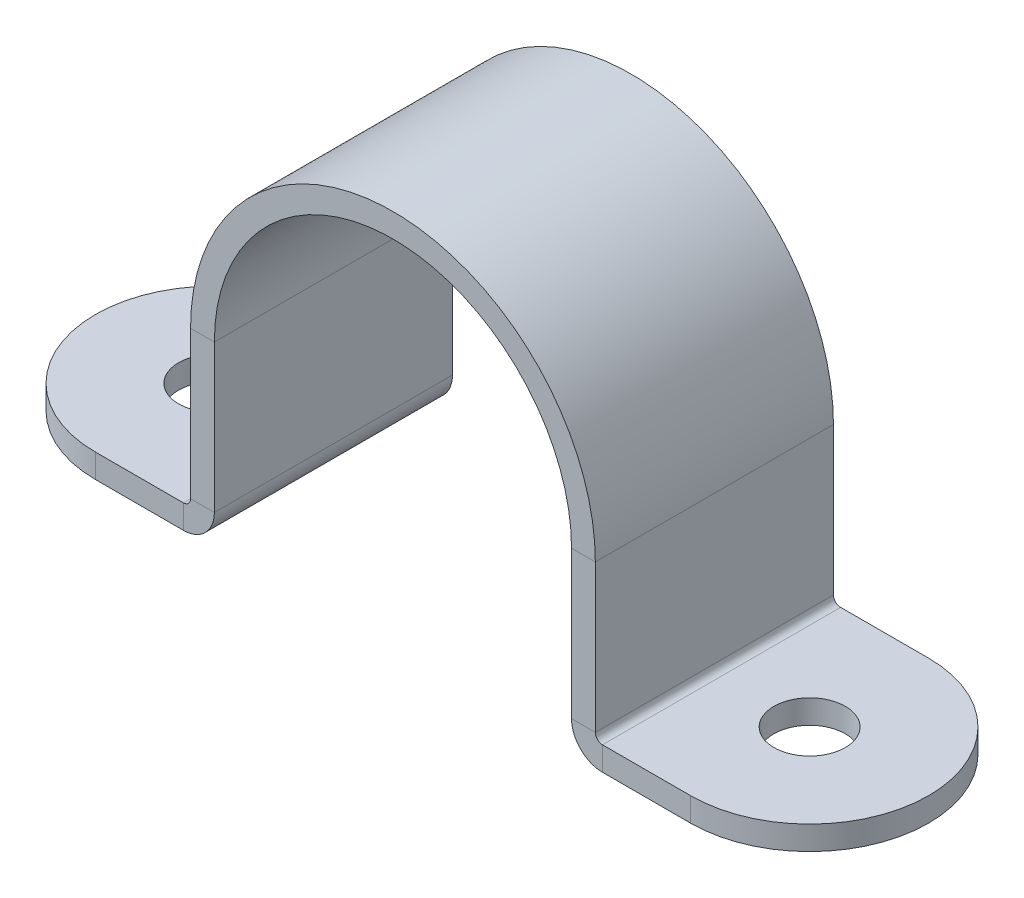
ISO-10303-21;
HEADER;
FILE_DESCRIPTION(('STEP AP214'),'2;1');
FILE_NAME('part.step','',(''),(''),'','','');
FILE_SCHEMA(('AUTOMOTIVE_DESIGN { 1 0 10303 214 1 1 1 1 }'));
ENDSEC;
DATA;
#1=APPLICATION_CONTEXT('core data for automotive mechanical design processes');
#2=APPLICATION_PROTOCOL_DEFINITION('international standard','automotive_design',2000,#1);
#3=PRODUCT_CONTEXT('',#1,'mechanical');
#4=PRODUCT('Part','Part','',(#3));
#5=PRODUCT_RELATED_PRODUCT_CATEGORY('part','',(#4));
#6=PRODUCT_DEFINITION_FORMATION('','',#4);
#7=PRODUCT_DEFINITION_CONTEXT('part definition',#1,'design');
#8=PRODUCT_DEFINITION('design','',#6,#7);
#9=PRODUCT_DEFINITION_SHAPE('','',#8);
#10=(LENGTH_UNIT() NAMED_UNIT(*) SI_UNIT(.MILLI.,.METRE.));
#11=(NAMED_UNIT(*) PLANE_ANGLE_UNIT() SI_UNIT($,.RADIAN.));
#12=(NAMED_UNIT(*) SI_UNIT($,.STERADIAN.) SOLID_ANGLE_UNIT());
#13=UNCERTAINTY_MEASURE_WITH_UNIT(LENGTH_MEASURE(1.E-05),#10,'distance_accuracy_value','');
#14=(GEOMETRIC_REPRESENTATION_CONTEXT(3) GLOBAL_UNCERTAINTY_ASSIGNED_CONTEXT((#13)) GLOBAL_UNIT_ASSIGNED_CONTEXT((#10,
#11,#12)) REPRESENTATION_CONTEXT('',''));
#15=CARTESIAN_POINT('',(0.,0.,0.));
#16=DIRECTION('',(0.,0.,1.));
#17=DIRECTION('',(1.,0.,0.));
#18=AXIS2_PLACEMENT_3D('',#15,#16,#17);
#19=CARTESIAN_POINT('',(32.8246153846154,40.64,12.7));
#20=DIRECTION('',(0.,-1.,0.));
#21=DIRECTION('',(0.,0.,-1.));
#22=AXIS2_PLACEMENT_3D('',#19,#20,#21);
#23=CYLINDRICAL_SURFACE('',#22,3.81);
#24=CARTESIAN_POINT('',(32.8246153846154,0.,12.7));
#25=DIRECTION('',(0.,-1.,0.));
#26=DIRECTION('',(0.,0.,-1.));
#27=AXIS2_PLACEMENT_3D('',#24,#25,#26);
#28=CIRCLE('',#27,3.81);
#29=CARTESIAN_POINT('',(32.8246153846154,0.,8.89000000000004));
#30=VERTEX_POINT('',#29);
#31=EDGE_CURVE('E232',#30,#30,#28,.T.);
#32=ORIENTED_EDGE('',*,*,#31,.T.);
#33=EDGE_LOOP('',(#32));
#34=FACE_BOUND('',#33,.T.);
#35=CARTESIAN_POINT('',(32.8246153846154,2.53999999999999,12.7));
#36=DIRECTION('',(0.,-1.,0.));
#37=DIRECTION('',(0.,0.,-1.));
#38=AXIS2_PLACEMENT_3D('',#35,#36,#37);
#39=CIRCLE('',#38,3.81);
#40=CARTESIAN_POINT('',(32.8246153846154,2.53999999999999,8.89000000000004));
#41=VERTEX_POINT('',#40);
#42=EDGE_CURVE('E212',#41,#41,#39,.T.);
#43=ORIENTED_EDGE('',*,*,#42,.F.);
#44=EDGE_LOOP('',(#43));
#45=FACE_BOUND('',#44,.T.);
#46=ADVANCED_FACE('F43',(#34,#45),#23,.F.);
#47=CARTESIAN_POINT('',(32.8246153846154,69.8744370734619,12.7));
#48=DIRECTION('',(0.,-1.,0.));
#49=DIRECTION('',(0.,0.,-1.));
#50=AXIS2_PLACEMENT_3D('',#47,#48,#49);
#51=CYLINDRICAL_SURFACE('',#50,12.7);
#52=DIRECTION('',(0.,-1.,0.));
#53=VECTOR('',#52,1.);
#54=CARTESIAN_POINT('',(32.8246153846154,69.8744370734619,25.4));
#55=LINE('',#54,#53);
#56=CARTESIAN_POINT('',(32.8246153846154,2.54,25.4));
#57=VERTEX_POINT('',#56);
#58=CARTESIAN_POINT('',(32.8246153846154,0.,25.4));
#59=VERTEX_POINT('',#58);
#60=EDGE_CURVE('E230',#57,#59,#55,.T.);
#61=ORIENTED_EDGE('',*,*,#60,.T.);
#62=CARTESIAN_POINT('',(32.8246153846154,0.,12.7));
#63=DIRECTION('',(0.,1.,0.));
#64=DIRECTION('',(-1.,0.,0.));
#65=AXIS2_PLACEMENT_3D('',#62,#63,#64);
#66=CIRCLE('',#65,12.7);
#67=CARTESIAN_POINT('',(32.8246153846154,0.,0.));
#68=VERTEX_POINT('',#67);
#69=EDGE_CURVE('E75',#68,#59,#66,.F.);
#70=ORIENTED_EDGE('',*,*,#69,.F.);
#71=DIRECTION('',(0.,-1.,0.));
#72=VECTOR('',#71,1.);
#73=CARTESIAN_POINT('',(32.8246153846154,69.8744370734619,0.));
#74=LINE('',#73,#72);
#75=CARTESIAN_POINT('',(32.8246153846154,2.53999999999997,0.));
#76=VERTEX_POINT('',#75);
#77=EDGE_CURVE('E216',#76,#68,#74,.T.);
#78=ORIENTED_EDGE('',*,*,#77,.F.);
#79=CARTESIAN_POINT('',(32.8246153846154,2.53999999999999,12.7));
#80=DIRECTION('',(0.,-1.,0.));
#81=DIRECTION('',(0.,0.,-1.));
#82=AXIS2_PLACEMENT_3D('',#79,#80,#81);
#83=CIRCLE('',#82,12.7);
#84=EDGE_CURVE('E11',#57,#76,#83,.F.);
#85=ORIENTED_EDGE('',*,*,#84,.F.);
#86=EDGE_LOOP('',(#61,#70,#78,#85));
#87=FACE_BOUND('',#86,.T.);
#88=ADVANCED_FACE('F411',(#87),#51,.T.);
#89=CARTESIAN_POINT('',(22.6646153846154,69.8744370734619,25.4));
#90=DIRECTION('',(0.,0.,1.));
#91=DIRECTION('',(1.,0.,0.));
#92=AXIS2_PLACEMENT_3D('',#89,#90,#91);
#93=PLANE('',#92);
#94=DIRECTION('',(1.,0.,0.));
#95=VECTOR('',#94,1.);
#96=CARTESIAN_POINT('',(20.1246153846154,0.,25.4));
#97=LINE('',#96,#95);
#98=CARTESIAN_POINT('',(23.4266153846154,0.,25.4));
#99=VERTEX_POINT('',#98);
#100=EDGE_CURVE('E228',#99,#59,#97,.T.);
#101=ORIENTED_EDGE('',*,*,#100,.T.);
#102=ORIENTED_EDGE('',*,*,#60,.F.);
#103=DIRECTION('',(-1.,0.,0.));
#104=VECTOR('',#103,1.);
#105=CARTESIAN_POINT('',(22.6646153846154,2.54,25.4));
#106=LINE('',#105,#104);
#107=CARTESIAN_POINT('',(23.4266153846154,2.54000000000001,25.4));
#108=VERTEX_POINT('',#107);
#109=EDGE_CURVE('E225',#57,#108,#106,.T.);
#110=ORIENTED_EDGE('',*,*,#109,.T.);
#111=DIRECTION('',(0.,-1.,0.));
#112=VECTOR('',#111,1.);
#113=CARTESIAN_POINT('',(23.4266153846154,69.8744370734619,25.4));
#114=LINE('',#113,#112);
#115=EDGE_CURVE('E222',#108,#99,#114,.T.);
#116=ORIENTED_EDGE('',*,*,#115,.T.);
#117=EDGE_LOOP('',(#101,#102,#110,#116));
#118=FACE_BOUND('',#117,.T.);
#119=ADVANCED_FACE('F408',(#118),#93,.T.);
#120=CARTESIAN_POINT('',(20.1246153846154,0.,25.4));
#121=DIRECTION('',(0.,1.,0.));
#122=DIRECTION('',(-1.,0.,0.));
#123=AXIS2_PLACEMENT_3D('',#120,#121,#122);
#124=PLANE('',#123);
#125=ORIENTED_EDGE('',*,*,#31,.F.);
#126=EDGE_LOOP('',(#125));
#127=FACE_BOUND('',#126,.T.);
#128=ORIENTED_EDGE('',*,*,#100,.F.);
#129=DIRECTION('',(0.,0.,-1.));
#130=VECTOR('',#129,1.);
#131=CARTESIAN_POINT('',(23.4266153846154,0.,25.4));
#132=LINE('',#131,#130);
#133=CARTESIAN_POINT('',(23.4266153846154,0.,0.));
#134=VERTEX_POINT('',#133);
#135=EDGE_CURVE('E220',#99,#134,#132,.T.);
#136=ORIENTED_EDGE('',*,*,#135,.T.);
#137=DIRECTION('',(-1.,0.,0.));
#138=VECTOR('',#137,1.);
#139=CARTESIAN_POINT('',(22.6646153846154,0.,0.));
#140=LINE('',#139,#138);
#141=EDGE_CURVE('E80',#68,#134,#140,.T.);
#142=ORIENTED_EDGE('',*,*,#141,.F.);
#143=ORIENTED_EDGE('',*,*,#69,.T.);
#144=EDGE_LOOP('',(#128,#136,#142,#143));
#145=FACE_BOUND('',#144,.T.);
#146=ADVANCED_FACE('F405',(#127,#145),#124,.F.);
#147=CARTESIAN_POINT('',(22.6646153846154,69.8744370734619,0.));
#148=DIRECTION('',(0.,0.,1.));
#149=DIRECTION('',(1.,0.,0.));
#150=AXIS2_PLACEMENT_3D('',#147,#148,#149);
#151=PLANE('',#150);
#152=ORIENTED_EDGE('',*,*,#77,.T.);
#153=ORIENTED_EDGE('',*,*,#141,.T.);
#154=DIRECTION('',(0.,-1.,0.));
#155=VECTOR('',#154,1.);
#156=CARTESIAN_POINT('',(23.4266153846154,69.8744370734619,0.));
#157=LINE('',#156,#155);
#158=CARTESIAN_POINT('',(23.4266153846154,2.53999999999999,0.));
#159=VERTEX_POINT('',#158);
#160=EDGE_CURVE('E47',#159,#134,#157,.T.);
#161=ORIENTED_EDGE('',*,*,#160,.F.);
#162=DIRECTION('',(-1.,0.,0.));
#163=VECTOR('',#162,1.);
#164=CARTESIAN_POINT('',(22.6646153846154,2.53999999999998,0.));
#165=LINE('',#164,#163);
#166=EDGE_CURVE('E210',#76,#159,#165,.T.);
#167=ORIENTED_EDGE('',*,*,#166,.F.);
#168=EDGE_LOOP('',(#152,#153,#161,#167));
#169=FACE_BOUND('',#168,.T.);
#170=ADVANCED_FACE('F413',(#169),#151,.F.);
#171=CARTESIAN_POINT('',(22.6646153846154,2.54,25.4));
#172=DIRECTION('',(0.,-1.,0.));
#173=DIRECTION('',(0.,0.,-1.));
#174=AXIS2_PLACEMENT_3D('',#171,#172,#173);
#175=PLANE('',#174);
#176=ORIENTED_EDGE('',*,*,#42,.T.);
#177=EDGE_LOOP('',(#176));
#178=FACE_BOUND('',#177,.T.);
#179=ORIENTED_EDGE('',*,*,#166,.T.);
#180=DIRECTION('',(0.,0.,1.));
#181=VECTOR('',#180,1.);
#182=CARTESIAN_POINT('',(23.4266153846154,2.54,25.4));
#183=LINE('',#182,#181);
#184=EDGE_CURVE('E53',#159,#108,#183,.T.);
#185=ORIENTED_EDGE('',*,*,#184,.T.);
#186=ORIENTED_EDGE('',*,*,#109,.F.);
#187=ORIENTED_EDGE('',*,*,#84,.T.);
#188=EDGE_LOOP('',(#179,#185,#186,#187));
#189=FACE_BOUND('',#188,.T.);
#190=ADVANCED_FACE('F45',(#178,#189),#175,.F.);
#191=CARTESIAN_POINT('',(-37.1069331648408,38.1,0.));
#192=DIRECTION('',(0.,0.,1.));
#193=DIRECTION('',(0.,-1.,0.));
#194=AXIS2_PLACEMENT_3D('',#191,#192,#193);
#195=PLANE('',#194);
#196=DIRECTION('',(1.,0.,0.));
#197=VECTOR('',#196,1.);
#198=CARTESIAN_POINT('',(-37.1069331648408,19.05,0.));
#199=LINE('',#198,#197);
#200=CARTESIAN_POINT('',(20.1246153846154,19.05,0.));
#201=VERTEX_POINT('',#200);
#202=CARTESIAN_POINT('',(22.6646153846154,19.05,0.));
#203=VERTEX_POINT('',#202);
#204=EDGE_CURVE('E199',#201,#203,#199,.T.);
#205=ORIENTED_EDGE('',*,*,#204,.T.);
#206=DIRECTION('',(0.,-1.,0.));
#207=VECTOR('',#206,1.);
#208=CARTESIAN_POINT('',(22.6646153846154,38.1,0.));
#209=LINE('',#208,#207);
#210=CARTESIAN_POINT('',(22.6646153846154,3.302,0.));
#211=VERTEX_POINT('',#210);
#212=EDGE_CURVE('E197',#203,#211,#209,.T.);
#213=ORIENTED_EDGE('',*,*,#212,.T.);
#214=DIRECTION('',(1.,0.,0.));
#215=VECTOR('',#214,1.);
#216=CARTESIAN_POINT('',(-37.1069331648408,3.30200000000003,0.));
#217=LINE('',#216,#215);
#218=CARTESIAN_POINT('',(20.1246153846154,3.30200000000005,0.));
#219=VERTEX_POINT('',#218);
#220=EDGE_CURVE('E182',#219,#211,#217,.T.);
#221=ORIENTED_EDGE('',*,*,#220,.F.);
#222=DIRECTION('',(0.,-1.,0.));
#223=VECTOR('',#222,1.);
#224=CARTESIAN_POINT('',(20.1246153846154,38.1,0.));
#225=LINE('',#224,#223);
#226=EDGE_CURVE('E177',#201,#219,#225,.T.);
#227=ORIENTED_EDGE('',*,*,#226,.F.);
#228=EDGE_LOOP('',(#205,#213,#221,#227));
#229=FACE_BOUND('',#228,.T.);
#230=ADVANCED_FACE('F195',(#229),#195,.F.);
#231=CARTESIAN_POINT('',(22.6646153846154,40.64,25.4));
#232=DIRECTION('',(-1.,0.,0.));
#233=DIRECTION('',(0.,-1.,0.));
#234=AXIS2_PLACEMENT_3D('',#231,#232,#233);
#235=PLANE('',#234);
#236=DIRECTION('',(0.,1.,0.));
#237=VECTOR('',#236,1.);
#238=CARTESIAN_POINT('',(22.6646153846154,40.64,25.4));
#239=LINE('',#238,#237);
#240=CARTESIAN_POINT('',(22.6646153846154,3.30200000000007,25.4));
#241=VERTEX_POINT('',#240);
#242=CARTESIAN_POINT('',(22.6646153846154,19.05,25.4));
#243=VERTEX_POINT('',#242);
#244=EDGE_CURVE('E244',#241,#243,#239,.T.);
#245=ORIENTED_EDGE('',*,*,#244,.F.);
#246=DIRECTION('',(0.,0.,-1.));
#247=VECTOR('',#246,1.);
#248=CARTESIAN_POINT('',(22.6646153846154,3.30200000000001,25.4));
#249=LINE('',#248,#247);
#250=EDGE_CURVE('E250',#241,#211,#249,.T.);
#251=ORIENTED_EDGE('',*,*,#250,.T.);
#252=ORIENTED_EDGE('',*,*,#212,.F.);
#253=DIRECTION('',(0.,0.,-1.));
#254=VECTOR('',#253,1.);
#255=CARTESIAN_POINT('',(22.6646153846154,19.05,25.4));
#256=LINE('',#255,#254);
#257=EDGE_CURVE('E247',#203,#243,#256,.F.);
#258=ORIENTED_EDGE('',*,*,#257,.T.);
#259=EDGE_LOOP('',(#245,#251,#252,#258));
#260=FACE_BOUND('',#259,.T.);
#261=ADVANCED_FACE('F253',(#260),#235,.F.);
#262=CARTESIAN_POINT('',(-37.1069331648408,38.1,25.4));
#263=DIRECTION('',(0.,0.,1.));
#264=DIRECTION('',(0.,-1.,0.));
#265=AXIS2_PLACEMENT_3D('',#262,#263,#264);
#266=PLANE('',#265);
#267=ORIENTED_EDGE('',*,*,#244,.T.);
#268=DIRECTION('',(1.,0.,0.));
#269=VECTOR('',#268,1.);
#270=CARTESIAN_POINT('',(-37.1069331648408,19.05,25.4));
#271=LINE('',#270,#269);
#272=CARTESIAN_POINT('',(20.1246153846154,19.05,25.4));
#273=VERTEX_POINT('',#272);
#274=EDGE_CURVE('E200',#273,#243,#271,.T.);
#275=ORIENTED_EDGE('',*,*,#274,.F.);
#276=DIRECTION('',(0.,-1.,0.));
#277=VECTOR('',#276,1.);
#278=CARTESIAN_POINT('',(20.1246153846154,38.1,25.4));
#279=LINE('',#278,#277);
#280=CARTESIAN_POINT('',(20.1246153846154,3.3020000000001,25.4));
#281=VERTEX_POINT('',#280);
#282=EDGE_CURVE('E242',#273,#281,#279,.T.);
#283=ORIENTED_EDGE('',*,*,#282,.T.);
#284=DIRECTION('',(1.,0.,0.));
#285=VECTOR('',#284,1.);
#286=CARTESIAN_POINT('',(-37.1069331648408,3.30200000000005,25.4));
#287=LINE('',#286,#285);
#288=EDGE_CURVE('E192',#281,#241,#287,.T.);
#289=ORIENTED_EDGE('',*,*,#288,.T.);
#290=EDGE_LOOP('',(#267,#275,#283,#289));
#291=FACE_BOUND('',#290,.T.);
#292=ADVANCED_FACE('F403',(#291),#266,.T.);
#293=CARTESIAN_POINT('',(20.1246153846154,38.1,25.4));
#294=DIRECTION('',(1.,0.,0.));
#295=DIRECTION('',(0.,1.,0.));
#296=AXIS2_PLACEMENT_3D('',#293,#294,#295);
#297=PLANE('',#296);
#298=ORIENTED_EDGE('',*,*,#226,.T.);
#299=DIRECTION('',(0.,0.,1.));
#300=VECTOR('',#299,1.);
#301=CARTESIAN_POINT('',(20.1246153846154,3.30200000000001,25.4));
#302=LINE('',#301,#300);
#303=EDGE_CURVE('E165',#219,#281,#302,.T.);
#304=ORIENTED_EDGE('',*,*,#303,.T.);
#305=ORIENTED_EDGE('',*,*,#282,.F.);
#306=DIRECTION('',(0.,0.,1.));
#307=VECTOR('',#306,1.);
#308=CARTESIAN_POINT('',(20.1246153846154,19.05,0.));
#309=LINE('',#308,#307);
#310=EDGE_CURVE('E176',#273,#201,#309,.F.);
#311=ORIENTED_EDGE('',*,*,#310,.T.);
#312=EDGE_LOOP('',(#298,#304,#305,#311));
#313=FACE_BOUND('',#312,.T.);
#314=ADVANCED_FACE('F188',(#313),#297,.F.);
#315=CARTESIAN_POINT('',(-80.2869331648408,2.54,25.4));
#316=DIRECTION('',(0.,0.,1.));
#317=DIRECTION('',(0.,1.,0.));
#318=AXIS2_PLACEMENT_3D('',#315,#316,#317);
#319=PLANE('',#318);
#320=DIRECTION('',(0.,1.,0.));
#321=VECTOR('',#320,1.);
#322=CARTESIAN_POINT('',(-17.9753846153846,0.,25.4));
#323=LINE('',#322,#321);
#324=CARTESIAN_POINT('',(-17.9753846153846,3.302,25.4));
#325=VERTEX_POINT('',#324);
#326=CARTESIAN_POINT('',(-17.9753846153846,19.05,25.4));
#327=VERTEX_POINT('',#326);
#328=EDGE_CURVE('E323',#325,#327,#323,.T.);
#329=ORIENTED_EDGE('',*,*,#328,.T.);
#330=DIRECTION('',(1.,0.,0.));
#331=VECTOR('',#330,1.);
#332=CARTESIAN_POINT('',(-80.2869331648408,19.05,25.4));
#333=LINE('',#332,#331);
#334=CARTESIAN_POINT('',(-20.5153846153846,19.05,25.4));
#335=VERTEX_POINT('',#334);
#336=EDGE_CURVE('E347',#335,#327,#333,.T.);
#337=ORIENTED_EDGE('',*,*,#336,.F.);
#338=DIRECTION('',(0.,-1.,0.));
#339=VECTOR('',#338,1.);
#340=CARTESIAN_POINT('',(-20.5153846153846,2.54,25.4));
#341=LINE('',#340,#339);
#342=CARTESIAN_POINT('',(-20.5153846153846,3.302,25.4));
#343=VERTEX_POINT('',#342);
#344=EDGE_CURVE('E329',#335,#343,#341,.T.);
#345=ORIENTED_EDGE('',*,*,#344,.T.);
#346=DIRECTION('',(1.,0.,0.));
#347=VECTOR('',#346,1.);
#348=CARTESIAN_POINT('',(-80.2869331648408,3.302,25.4));
#349=LINE('',#348,#347);
#350=EDGE_CURVE('E348',#343,#325,#349,.T.);
#351=ORIENTED_EDGE('',*,*,#350,.T.);
#352=EDGE_LOOP('',(#329,#337,#345,#351));
#353=FACE_BOUND('',#352,.T.);
#354=ADVANCED_FACE('F469',(#353),#319,.T.);
#355=CARTESIAN_POINT('',(-80.2869331648408,2.54,0.));
#356=DIRECTION('',(0.,0.,1.));
#357=DIRECTION('',(0.,1.,0.));
#358=AXIS2_PLACEMENT_3D('',#355,#356,#357);
#359=PLANE('',#358);
#360=DIRECTION('',(1.,0.,0.));
#361=VECTOR('',#360,1.);
#362=CARTESIAN_POINT('',(-80.2869331648408,19.05,0.));
#363=LINE('',#362,#361);
#364=CARTESIAN_POINT('',(-20.5153846153846,19.05,0.));
#365=VERTEX_POINT('',#364);
#366=CARTESIAN_POINT('',(-17.9753846153846,19.05,0.));
#367=VERTEX_POINT('',#366);
#368=EDGE_CURVE('E344',#365,#367,#363,.T.);
#369=ORIENTED_EDGE('',*,*,#368,.T.);
#370=DIRECTION('',(0.,-1.,0.));
#371=VECTOR('',#370,1.);
#372=CARTESIAN_POINT('',(-17.9753846153846,2.54,0.));
#373=LINE('',#372,#371);
#374=CARTESIAN_POINT('',(-17.9753846153846,3.302,0.));
#375=VERTEX_POINT('',#374);
#376=EDGE_CURVE('E204',#367,#375,#373,.T.);
#377=ORIENTED_EDGE('',*,*,#376,.T.);
#378=DIRECTION('',(1.,0.,0.));
#379=VECTOR('',#378,1.);
#380=CARTESIAN_POINT('',(-80.2869331648408,3.302,0.));
#381=LINE('',#380,#379);
#382=CARTESIAN_POINT('',(-20.5153846153846,3.302,0.));
#383=VERTEX_POINT('',#382);
#384=EDGE_CURVE('E341',#383,#375,#381,.T.);
#385=ORIENTED_EDGE('',*,*,#384,.F.);
#386=DIRECTION('',(0.,-1.,0.));
#387=VECTOR('',#386,1.);
#388=CARTESIAN_POINT('',(-20.5153846153846,2.54,0.));
#389=LINE('',#388,#387);
#390=EDGE_CURVE('E335',#365,#383,#389,.T.);
#391=ORIENTED_EDGE('',*,*,#390,.F.);
#392=EDGE_LOOP('',(#369,#377,#385,#391));
#393=FACE_BOUND('',#392,.T.);
#394=ADVANCED_FACE('F355',(#393),#359,.F.);
#395=CARTESIAN_POINT('',(-20.5153846153846,2.54,25.4));
#396=DIRECTION('',(1.,0.,0.));
#397=DIRECTION('',(0.,0.,-1.));
#398=AXIS2_PLACEMENT_3D('',#395,#396,#397);
#399=PLANE('',#398);
#400=ORIENTED_EDGE('',*,*,#390,.T.);
#401=DIRECTION('',(0.,0.,1.));
#402=VECTOR('',#401,1.);
#403=CARTESIAN_POINT('',(-20.5153846153846,3.302,25.4));
#404=LINE('',#403,#402);
#405=EDGE_CURVE('E338',#383,#343,#404,.T.);
#406=ORIENTED_EDGE('',*,*,#405,.T.);
#407=ORIENTED_EDGE('',*,*,#344,.F.);
#408=DIRECTION('',(0.,0.,-1.));
#409=VECTOR('',#408,1.);
#410=CARTESIAN_POINT('',(-20.5153846153846,19.05,25.4));
#411=LINE('',#410,#409);
#412=EDGE_CURVE('E332',#335,#365,#411,.T.);
#413=ORIENTED_EDGE('',*,*,#412,.T.);
#414=EDGE_LOOP('',(#400,#406,#407,#413));
#415=FACE_BOUND('',#414,.T.);
#416=ADVANCED_FACE('F392',(#415),#399,.F.);
#417=CARTESIAN_POINT('',(-17.9753846153846,0.,25.4));
#418=DIRECTION('',(-1.,0.,0.));
#419=DIRECTION('',(0.,0.,1.));
#420=AXIS2_PLACEMENT_3D('',#417,#418,#419);
#421=PLANE('',#420);
#422=ORIENTED_EDGE('',*,*,#328,.F.);
#423=DIRECTION('',(0.,0.,-1.));
#424=VECTOR('',#423,1.);
#425=CARTESIAN_POINT('',(-17.9753846153846,3.302,25.4));
#426=LINE('',#425,#424);
#427=EDGE_CURVE('E326',#325,#375,#426,.T.);
#428=ORIENTED_EDGE('',*,*,#427,.T.);
#429=ORIENTED_EDGE('',*,*,#376,.F.);
#430=DIRECTION('',(0.,0.,1.));
#431=VECTOR('',#430,1.);
#432=CARTESIAN_POINT('',(-17.9753846153846,19.05,0.));
#433=LINE('',#432,#431);
#434=EDGE_CURVE('E287',#367,#327,#433,.T.);
#435=ORIENTED_EDGE('',*,*,#434,.T.);
#436=EDGE_LOOP('',(#422,#428,#429,#435));
#437=FACE_BOUND('',#436,.T.);
#438=ADVANCED_FACE('F359',(#437),#421,.F.);
#439=CARTESIAN_POINT('',(-30.6753846153846,69.8744370734619,12.7));
#440=DIRECTION('',(0.,-1.,0.));
#441=DIRECTION('',(0.,0.,-1.));
#442=AXIS2_PLACEMENT_3D('',#439,#440,#441);
#443=CYLINDRICAL_SURFACE('',#442,12.7);
#444=DIRECTION('',(0.,-1.,0.));
#445=VECTOR('',#444,1.);
#446=CARTESIAN_POINT('',(-30.6753846153846,69.8744370734619,0.));
#447=LINE('',#446,#445);
#448=CARTESIAN_POINT('',(-30.6753846153846,2.54,0.));
#449=VERTEX_POINT('',#448);
#450=CARTESIAN_POINT('',(-30.6753846153846,0.,0.));
#451=VERTEX_POINT('',#450);
#452=EDGE_CURVE('E312',#449,#451,#447,.T.);
#453=ORIENTED_EDGE('',*,*,#452,.T.);
#454=CARTESIAN_POINT('',(-30.6753846153846,0.,12.7));
#455=DIRECTION('',(0.,1.,0.));
#456=DIRECTION('',(0.,0.,1.));
#457=AXIS2_PLACEMENT_3D('',#454,#455,#456);
#458=CIRCLE('',#457,12.7);
#459=CARTESIAN_POINT('',(-30.6753846153846,0.,25.4));
#460=VERTEX_POINT('',#459);
#461=EDGE_CURVE('E297',#460,#451,#458,.F.);
#462=ORIENTED_EDGE('',*,*,#461,.F.);
#463=DIRECTION('',(0.,-1.,0.));
#464=VECTOR('',#463,1.);
#465=CARTESIAN_POINT('',(-30.6753846153846,69.8744370734619,25.4));
#466=LINE('',#465,#464);
#467=CARTESIAN_POINT('',(-30.6753846153846,2.54,25.4));
#468=VERTEX_POINT('',#467);
#469=EDGE_CURVE('E284',#468,#460,#466,.T.);
#470=ORIENTED_EDGE('',*,*,#469,.F.);
#471=CARTESIAN_POINT('',(-30.6753846153846,2.54,12.7));
#472=DIRECTION('',(0.,-1.,0.));
#473=DIRECTION('',(0.,0.,-1.));
#474=AXIS2_PLACEMENT_3D('',#471,#472,#473);
#475=CIRCLE('',#474,12.7);
#476=EDGE_CURVE('E302',#449,#468,#475,.F.);
#477=ORIENTED_EDGE('',*,*,#476,.F.);
#478=EDGE_LOOP('',(#453,#462,#470,#477));
#479=FACE_BOUND('',#478,.T.);
#480=ADVANCED_FACE('F380',(#479),#443,.T.);
#481=CARTESIAN_POINT('',(-30.6753846153846,40.64,12.7));
#482=DIRECTION('',(0.,-1.,0.));
#483=DIRECTION('',(0.,0.,-1.));
#484=AXIS2_PLACEMENT_3D('',#481,#482,#483);
#485=CYLINDRICAL_SURFACE('',#484,3.81);
#486=CARTESIAN_POINT('',(-30.6753846153846,0.,12.7));
#487=DIRECTION('',(0.,-1.,0.));
#488=DIRECTION('',(0.,0.,-1.));
#489=AXIS2_PLACEMENT_3D('',#486,#487,#488);
#490=CIRCLE('',#489,3.81);
#491=CARTESIAN_POINT('',(-30.6753846153846,0.,8.89));
#492=VERTEX_POINT('',#491);
#493=EDGE_CURVE('E309',#492,#492,#490,.T.);
#494=ORIENTED_EDGE('',*,*,#493,.T.);
#495=EDGE_LOOP('',(#494));
#496=FACE_BOUND('',#495,.T.);
#497=CARTESIAN_POINT('',(-30.6753846153846,2.54,12.7));
#498=DIRECTION('',(0.,-1.,0.));
#499=DIRECTION('',(0.,0.,-1.));
#500=AXIS2_PLACEMENT_3D('',#497,#498,#499);
#501=CIRCLE('',#500,3.81);
#502=CARTESIAN_POINT('',(-30.6753846153846,2.54,8.89));
#503=VERTEX_POINT('',#502);
#504=EDGE_CURVE('E306',#503,#503,#501,.T.);
#505=ORIENTED_EDGE('',*,*,#504,.F.);
#506=EDGE_LOOP('',(#505));
#507=FACE_BOUND('',#506,.T.);
#508=ADVANCED_FACE('F567',(#496,#507),#485,.F.);
#509=CARTESIAN_POINT('',(-43.3753846153846,2.54,25.4));
#510=DIRECTION('',(0.,-1.,0.));
#511=DIRECTION('',(0.,0.,-1.));
#512=AXIS2_PLACEMENT_3D('',#509,#510,#511);
#513=PLANE('',#512);
#514=ORIENTED_EDGE('',*,*,#504,.T.);
#515=EDGE_LOOP('',(#514));
#516=FACE_BOUND('',#515,.T.);
#517=DIRECTION('',(0.,0.,1.));
#518=VECTOR('',#517,1.);
#519=CARTESIAN_POINT('',(-21.2773846153846,2.54,25.4));
#520=LINE('',#519,#518);
#521=CARTESIAN_POINT('',(-21.2773846153846,2.54,0.));
#522=VERTEX_POINT('',#521);
#523=CARTESIAN_POINT('',(-21.2773846153846,2.54,25.4));
#524=VERTEX_POINT('',#523);
#525=EDGE_CURVE('E280',#522,#524,#520,.T.);
#526=ORIENTED_EDGE('',*,*,#525,.F.);
#527=DIRECTION('',(-1.,0.,0.));
#528=VECTOR('',#527,1.);
#529=CARTESIAN_POINT('',(-43.3753846153846,2.54,0.));
#530=LINE('',#529,#528);
#531=EDGE_CURVE('E304',#522,#449,#530,.T.);
#532=ORIENTED_EDGE('',*,*,#531,.T.);
#533=ORIENTED_EDGE('',*,*,#476,.T.);
#534=DIRECTION('',(-1.,0.,0.));
#535=VECTOR('',#534,1.);
#536=CARTESIAN_POINT('',(-43.3753846153846,2.54,25.4));
#537=LINE('',#536,#535);
#538=EDGE_CURVE('E288',#524,#468,#537,.T.);
#539=ORIENTED_EDGE('',*,*,#538,.F.);
#540=EDGE_LOOP('',(#526,#532,#533,#539));
#541=FACE_BOUND('',#540,.T.);
#542=ADVANCED_FACE('F375',(#516,#541),#513,.F.);
#543=CARTESIAN_POINT('',(-43.3753846153846,69.8744370734619,0.));
#544=DIRECTION('',(0.,0.,1.));
#545=DIRECTION('',(1.,0.,0.));
#546=AXIS2_PLACEMENT_3D('',#543,#544,#545);
#547=PLANE('',#546);
#548=DIRECTION('',(0.,-1.,0.));
#549=VECTOR('',#548,1.);
#550=CARTESIAN_POINT('',(-21.2773846153846,69.8744370734619,0.));
#551=LINE('',#550,#549);
#552=CARTESIAN_POINT('',(-21.2773846153846,0.,0.));
#553=VERTEX_POINT('',#552);
#554=EDGE_CURVE('E299',#522,#553,#551,.T.);
#555=ORIENTED_EDGE('',*,*,#554,.T.);
#556=DIRECTION('',(1.,0.,0.));
#557=VECTOR('',#556,1.);
#558=CARTESIAN_POINT('',(-43.3753846153846,0.,0.));
#559=LINE('',#558,#557);
#560=EDGE_CURVE('E294',#451,#553,#559,.T.);
#561=ORIENTED_EDGE('',*,*,#560,.F.);
#562=ORIENTED_EDGE('',*,*,#452,.F.);
#563=ORIENTED_EDGE('',*,*,#531,.F.);
#564=EDGE_LOOP('',(#555,#561,#562,#563));
#565=FACE_BOUND('',#564,.T.);
#566=ADVANCED_FACE('F384',(#565),#547,.F.);
#567=CARTESIAN_POINT('',(-43.3753846153846,0.,25.4));
#568=DIRECTION('',(0.,1.,0.));
#569=DIRECTION('',(0.,0.,1.));
#570=AXIS2_PLACEMENT_3D('',#567,#568,#569);
#571=PLANE('',#570);
#572=ORIENTED_EDGE('',*,*,#493,.F.);
#573=EDGE_LOOP('',(#572));
#574=FACE_BOUND('',#573,.T.);
#575=DIRECTION('',(0.,0.,-1.));
#576=VECTOR('',#575,1.);
#577=CARTESIAN_POINT('',(-21.2773846153846,0.,25.4));
#578=LINE('',#577,#576);
#579=CARTESIAN_POINT('',(-21.2773846153846,0.,25.4));
#580=VERTEX_POINT('',#579);
#581=EDGE_CURVE('E315',#580,#553,#578,.T.);
#582=ORIENTED_EDGE('',*,*,#581,.F.);
#583=DIRECTION('',(1.,0.,0.));
#584=VECTOR('',#583,1.);
#585=CARTESIAN_POINT('',(-43.3753846153846,0.,25.4));
#586=LINE('',#585,#584);
#587=EDGE_CURVE('E291',#460,#580,#586,.T.);
#588=ORIENTED_EDGE('',*,*,#587,.F.);
#589=ORIENTED_EDGE('',*,*,#461,.T.);
#590=ORIENTED_EDGE('',*,*,#560,.T.);
#591=EDGE_LOOP('',(#582,#588,#589,#590));
#592=FACE_BOUND('',#591,.T.);
#593=ADVANCED_FACE('F386',(#574,#592),#571,.F.);
#594=CARTESIAN_POINT('',(-43.3753846153846,69.8744370734619,25.4));
#595=DIRECTION('',(0.,0.,1.));
#596=DIRECTION('',(1.,0.,0.));
#597=AXIS2_PLACEMENT_3D('',#594,#595,#596);
#598=PLANE('',#597);
#599=ORIENTED_EDGE('',*,*,#587,.T.);
#600=DIRECTION('',(0.,-1.,0.));
#601=VECTOR('',#600,1.);
#602=CARTESIAN_POINT('',(-21.2773846153846,69.8744370734619,25.4));
#603=LINE('',#602,#601);
#604=EDGE_CURVE('E317',#524,#580,#603,.T.);
#605=ORIENTED_EDGE('',*,*,#604,.F.);
#606=ORIENTED_EDGE('',*,*,#538,.T.);
#607=ORIENTED_EDGE('',*,*,#469,.T.);
#608=EDGE_LOOP('',(#599,#605,#606,#607));
#609=FACE_BOUND('',#608,.T.);
#610=ADVANCED_FACE('F371',(#609),#598,.T.);
#611=CARTESIAN_POINT('',(-21.2773846153846,3.302,25.4));
#612=DIRECTION('',(0.,0.,1.));
#613=DIRECTION('',(1.,0.,0.));
#614=AXIS2_PLACEMENT_3D('',#611,#612,#613);
#615=PLANE('',#614);
#616=ORIENTED_EDGE('',*,*,#350,.F.);
#617=CARTESIAN_POINT('',(-21.2773846153846,3.302,25.4));
#618=DIRECTION('',(0.,0.,-1.));
#619=DIRECTION('',(-1.,0.,0.));
#620=AXIS2_PLACEMENT_3D('',#617,#618,#619);
#621=CIRCLE('',#620,0.762000000000001);
#622=EDGE_CURVE('E268',#343,#524,#621,.T.);
#623=ORIENTED_EDGE('',*,*,#622,.T.);
#624=ORIENTED_EDGE('',*,*,#604,.T.);
#625=CARTESIAN_POINT('',(-21.2773846153846,3.302,25.4));
#626=DIRECTION('',(0.,0.,-1.));
#627=DIRECTION('',(-1.,0.,0.));
#628=AXIS2_PLACEMENT_3D('',#625,#626,#627);
#629=CIRCLE('',#628,3.302);
#630=EDGE_CURVE('E274',#325,#580,#629,.T.);
#631=ORIENTED_EDGE('',*,*,#630,.F.);
#632=EDGE_LOOP('',(#616,#623,#624,#631));
#633=FACE_BOUND('',#632,.T.);
#634=ADVANCED_FACE('F366',(#633),#615,.T.);
#635=CARTESIAN_POINT('',(-21.2773846153846,3.302,0.));
#636=DIRECTION('',(0.,0.,-1.));
#637=DIRECTION('',(-1.,0.,0.));
#638=AXIS2_PLACEMENT_3D('',#635,#636,#637);
#639=PLANE('',#638);
#640=CARTESIAN_POINT('',(-21.2773846153846,3.302,0.));
#641=DIRECTION('',(0.,0.,-1.));
#642=DIRECTION('',(-1.,0.,0.));
#643=AXIS2_PLACEMENT_3D('',#640,#641,#642);
#644=CIRCLE('',#643,0.762000000000001);
#645=EDGE_CURVE('E278',#522,#383,#644,.F.);
#646=ORIENTED_EDGE('',*,*,#645,.T.);
#647=ORIENTED_EDGE('',*,*,#384,.T.);
#648=CARTESIAN_POINT('',(-21.2773846153846,3.302,0.));
#649=DIRECTION('',(0.,0.,-1.));
#650=DIRECTION('',(-1.,0.,0.));
#651=AXIS2_PLACEMENT_3D('',#648,#649,#650);
#652=CIRCLE('',#651,3.302);
#653=EDGE_CURVE('E277',#553,#375,#652,.F.);
#654=ORIENTED_EDGE('',*,*,#653,.F.);
#655=ORIENTED_EDGE('',*,*,#554,.F.);
#656=EDGE_LOOP('',(#646,#647,#654,#655));
#657=FACE_BOUND('',#656,.T.);
#658=ADVANCED_FACE('F388',(#657),#639,.T.);
#659=CARTESIAN_POINT('',(-21.2773846153846,3.302,173.528929841666));
#660=DIRECTION('',(0.,0.,-1.));
#661=DIRECTION('',(-1.,0.,0.));
#662=AXIS2_PLACEMENT_3D('',#659,#660,#661);
#663=CYLINDRICAL_SURFACE('',#662,3.302);
#664=ORIENTED_EDGE('',*,*,#581,.T.);
#665=ORIENTED_EDGE('',*,*,#653,.T.);
#666=ORIENTED_EDGE('',*,*,#427,.F.);
#667=ORIENTED_EDGE('',*,*,#630,.T.);
#668=EDGE_LOOP('',(#664,#665,#666,#667));
#669=FACE_BOUND('',#668,.T.);
#670=ADVANCED_FACE('F362',(#669),#663,.T.);
#671=CARTESIAN_POINT('',(-21.2773846153846,3.302,173.528929841666));
#672=DIRECTION('',(0.,0.,-1.));
#673=DIRECTION('',(-1.,0.,0.));
#674=AXIS2_PLACEMENT_3D('',#671,#672,#673);
#675=CYLINDRICAL_SURFACE('',#674,0.762000000000001);
#676=ORIENTED_EDGE('',*,*,#525,.T.);
#677=ORIENTED_EDGE('',*,*,#622,.F.);
#678=ORIENTED_EDGE('',*,*,#405,.F.);
#679=ORIENTED_EDGE('',*,*,#645,.F.);
#680=EDGE_LOOP('',(#676,#677,#678,#679));
#681=FACE_BOUND('',#680,.T.);
#682=ADVANCED_FACE('F509',(#681),#675,.F.);
#683=CARTESIAN_POINT('',(1.07461538461539,19.05,0.));
#684=DIRECTION('',(0.,0.,1.));
#685=DIRECTION('',(1.,0.,0.));
#686=AXIS2_PLACEMENT_3D('',#683,#684,#685);
#687=PLANE('',#686);
#688=ORIENTED_EDGE('',*,*,#204,.F.);
#689=CARTESIAN_POINT('',(1.07461538461539,19.05,0.));
#690=DIRECTION('',(0.,0.,1.));
#691=DIRECTION('',(0.,-1.,0.));
#692=AXIS2_PLACEMENT_3D('',#689,#690,#691);
#693=CIRCLE('',#692,19.05);
#694=EDGE_CURVE('E266',#367,#201,#693,.F.);
#695=ORIENTED_EDGE('',*,*,#694,.F.);
#696=ORIENTED_EDGE('',*,*,#368,.F.);
#697=CARTESIAN_POINT('',(1.07461538461539,19.05,0.));
#698=DIRECTION('',(0.,0.,1.));
#699=DIRECTION('',(0.,-1.,0.));
#700=AXIS2_PLACEMENT_3D('',#697,#698,#699);
#701=CIRCLE('',#700,21.59);
#702=EDGE_CURVE('E265',#365,#203,#701,.F.);
#703=ORIENTED_EDGE('',*,*,#702,.T.);
#704=EDGE_LOOP('',(#688,#695,#696,#703));
#705=FACE_BOUND('',#704,.T.);
#706=ADVANCED_FACE('F589',(#705),#687,.F.);
#707=CARTESIAN_POINT('',(1.07461538461539,19.05,25.4));
#708=DIRECTION('',(0.,0.,-1.));
#709=DIRECTION('',(-1.,0.,0.));
#710=AXIS2_PLACEMENT_3D('',#707,#708,#709);
#711=PLANE('',#710);
#712=ORIENTED_EDGE('',*,*,#336,.T.);
#713=CARTESIAN_POINT('',(1.07461538461539,19.05,25.4));
#714=DIRECTION('',(0.,0.,1.));
#715=DIRECTION('',(0.,-1.,0.));
#716=AXIS2_PLACEMENT_3D('',#713,#714,#715);
#717=CIRCLE('',#716,19.05);
#718=EDGE_CURVE('E269',#273,#327,#717,.T.);
#719=ORIENTED_EDGE('',*,*,#718,.F.);
#720=ORIENTED_EDGE('',*,*,#274,.T.);
#721=CARTESIAN_POINT('',(1.07461538461539,19.05,25.4));
#722=DIRECTION('',(0.,0.,1.));
#723=DIRECTION('',(0.,-1.,0.));
#724=AXIS2_PLACEMENT_3D('',#721,#722,#723);
#725=CIRCLE('',#724,21.59);
#726=EDGE_CURVE('E262',#243,#335,#725,.T.);
#727=ORIENTED_EDGE('',*,*,#726,.T.);
#728=EDGE_LOOP('',(#712,#719,#720,#727));
#729=FACE_BOUND('',#728,.T.);
#730=ADVANCED_FACE('F400',(#729),#711,.F.);
#731=CARTESIAN_POINT('',(1.07461538461539,19.0499999999999,-129.026085712951));
#732=DIRECTION('',(0.,0.,1.));
#733=DIRECTION('',(0.,-1.,0.));
#734=AXIS2_PLACEMENT_3D('',#731,#732,#733);
#735=CYLINDRICAL_SURFACE('',#734,21.59);
#736=ORIENTED_EDGE('',*,*,#726,.F.);
#737=ORIENTED_EDGE('',*,*,#257,.F.);
#738=ORIENTED_EDGE('',*,*,#702,.F.);
#739=ORIENTED_EDGE('',*,*,#412,.F.);
#740=EDGE_LOOP('',(#736,#737,#738,#739));
#741=FACE_BOUND('',#740,.T.);
#742=ADVANCED_FACE('F397',(#741),#735,.T.);
#743=CARTESIAN_POINT('',(1.07461538461539,19.0499999999999,-129.026085712951));
#744=DIRECTION('',(0.,0.,1.));
#745=DIRECTION('',(0.,-1.,0.));
#746=AXIS2_PLACEMENT_3D('',#743,#744,#745);
#747=CYLINDRICAL_SURFACE('',#746,19.05);
#748=ORIENTED_EDGE('',*,*,#718,.T.);
#749=ORIENTED_EDGE('',*,*,#434,.F.);
#750=ORIENTED_EDGE('',*,*,#694,.T.);
#751=ORIENTED_EDGE('',*,*,#310,.F.);
#752=EDGE_LOOP('',(#748,#749,#750,#751));
#753=FACE_BOUND('',#752,.T.);
#754=ADVANCED_FACE('F478',(#753),#747,.F.);
#755=CARTESIAN_POINT('',(23.4266153846154,3.30200000000001,25.4));
#756=DIRECTION('',(0.,0.,-1.));
#757=DIRECTION('',(0.,1.,0.));
#758=AXIS2_PLACEMENT_3D('',#755,#756,#757);
#759=PLANE('',#758);
#760=ORIENTED_EDGE('',*,*,#115,.F.);
#761=CARTESIAN_POINT('',(23.4266153846154,3.30200000000001,25.4));
#762=DIRECTION('',(0.,0.,-1.));
#763=DIRECTION('',(0.,1.,0.));
#764=AXIS2_PLACEMENT_3D('',#761,#762,#763);
#765=CIRCLE('',#764,0.761999999999998);
#766=EDGE_CURVE('E86',#241,#108,#765,.F.);
#767=ORIENTED_EDGE('',*,*,#766,.F.);
#768=ORIENTED_EDGE('',*,*,#288,.F.);
#769=CARTESIAN_POINT('',(23.4266153846154,3.30200000000001,25.4));
#770=DIRECTION('',(0.,0.,-1.));
#771=DIRECTION('',(0.,1.,0.));
#772=AXIS2_PLACEMENT_3D('',#769,#770,#771);
#773=CIRCLE('',#772,3.302);
#774=EDGE_CURVE('E171',#281,#99,#773,.F.);
#775=ORIENTED_EDGE('',*,*,#774,.T.);
#776=EDGE_LOOP('',(#760,#767,#768,#775));
#777=FACE_BOUND('',#776,.T.);
#778=ADVANCED_FACE('F404',(#777),#759,.F.);
#779=CARTESIAN_POINT('',(23.4266153846154,3.30199999999999,0.));
#780=DIRECTION('',(0.,0.,1.));
#781=DIRECTION('',(0.,-1.,0.));
#782=AXIS2_PLACEMENT_3D('',#779,#780,#781);
#783=PLANE('',#782);
#784=ORIENTED_EDGE('',*,*,#220,.T.);
#785=CARTESIAN_POINT('',(23.4266153846154,3.30199999999999,0.));
#786=DIRECTION('',(0.,0.,-1.));
#787=DIRECTION('',(0.,1.,0.));
#788=AXIS2_PLACEMENT_3D('',#785,#786,#787);
#789=CIRCLE('',#788,0.761999999999998);
#790=EDGE_CURVE('E257',#159,#211,#789,.T.);
#791=ORIENTED_EDGE('',*,*,#790,.F.);
#792=ORIENTED_EDGE('',*,*,#160,.T.);
#793=CARTESIAN_POINT('',(23.4266153846154,3.30199999999999,0.));
#794=DIRECTION('',(0.,0.,-1.));
#795=DIRECTION('',(0.,1.,0.));
#796=AXIS2_PLACEMENT_3D('',#793,#794,#795);
#797=CIRCLE('',#796,3.302);
#798=EDGE_CURVE('E169',#134,#219,#797,.T.);
#799=ORIENTED_EDGE('',*,*,#798,.T.);
#800=EDGE_LOOP('',(#784,#791,#792,#799));
#801=FACE_BOUND('',#800,.T.);
#802=ADVANCED_FACE('F180',(#801),#783,.F.);
#803=CARTESIAN_POINT('',(23.4266153846154,3.30200000000012,119.891746807374));
#804=DIRECTION('',(0.,0.,-1.));
#805=DIRECTION('',(0.,1.,0.));
#806=AXIS2_PLACEMENT_3D('',#803,#804,#805);
#807=CYLINDRICAL_SURFACE('',#806,3.302);
#808=ORIENTED_EDGE('',*,*,#798,.F.);
#809=ORIENTED_EDGE('',*,*,#135,.F.);
#810=ORIENTED_EDGE('',*,*,#774,.F.);
#811=ORIENTED_EDGE('',*,*,#303,.F.);
#812=EDGE_LOOP('',(#808,#809,#810,#811));
#813=FACE_BOUND('',#812,.T.);
#814=ADVANCED_FACE('F167',(#813),#807,.T.);
#815=CARTESIAN_POINT('',(23.4266153846154,3.30200000000012,119.891746807374));
#816=DIRECTION('',(0.,0.,-1.));
#817=DIRECTION('',(0.,1.,0.));
#818=AXIS2_PLACEMENT_3D('',#815,#816,#817);
#819=CYLINDRICAL_SURFACE('',#818,0.761999999999998);
#820=ORIENTED_EDGE('',*,*,#790,.T.);
#821=ORIENTED_EDGE('',*,*,#250,.F.);
#822=ORIENTED_EDGE('',*,*,#766,.T.);
#823=ORIENTED_EDGE('',*,*,#184,.F.);
#824=EDGE_LOOP('',(#820,#821,#822,#823));
#825=FACE_BOUND('',#824,.T.);
#826=ADVANCED_FACE('F255',(#825),#819,.F.);
#827=CLOSED_SHELL('',(#46,#88,#119,#146,#170,#190,#230,#261,#292,#314,#354,#394,#416,#438,#480,
#508,#542,#566,#593,#610,#634,#658,#670,#682,#706,#730,#742,#754,#778,#802,#814,#826));
#828=MANIFOLD_SOLID_BREP('B2',#827);
#829=ADVANCED_BREP_SHAPE_REPRESENTATION('',(#18,#828),#14);
#830=SHAPE_DEFINITION_REPRESENTATION(#9,#829);
ENDSEC;
END-ISO-10303-21;
